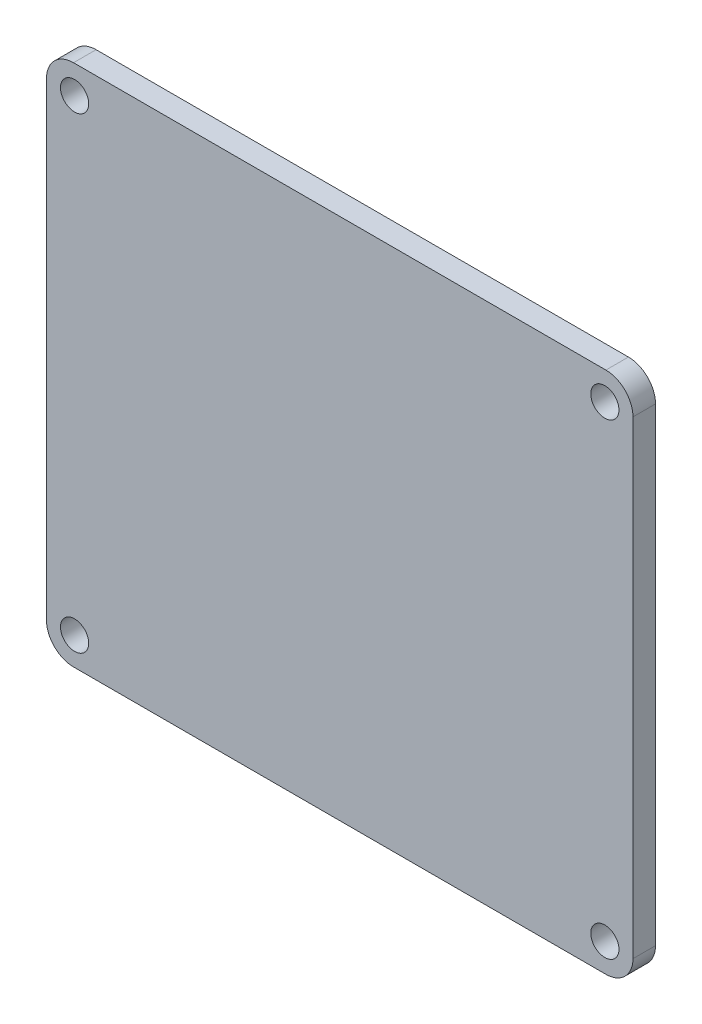
ISO-10303-21;
HEADER;
FILE_DESCRIPTION(('STEP AP214'),'2;1');
FILE_NAME('part.step','',(''),(''),'','','');
FILE_SCHEMA(('AUTOMOTIVE_DESIGN { 1 0 10303 214 1 1 1 1 }'));
ENDSEC;
DATA;
#1=APPLICATION_CONTEXT('core data for automotive mechanical design processes');
#2=APPLICATION_PROTOCOL_DEFINITION('international standard','automotive_design',2000,#1);
#3=PRODUCT_CONTEXT('',#1,'mechanical');
#4=PRODUCT('Part','Part','',(#3));
#5=PRODUCT_RELATED_PRODUCT_CATEGORY('part','',(#4));
#6=PRODUCT_DEFINITION_FORMATION('','',#4);
#7=PRODUCT_DEFINITION_CONTEXT('part definition',#1,'design');
#8=PRODUCT_DEFINITION('design','',#6,#7);
#9=PRODUCT_DEFINITION_SHAPE('','',#8);
#10=(LENGTH_UNIT() NAMED_UNIT(*) SI_UNIT(.MILLI.,.METRE.));
#11=(NAMED_UNIT(*) PLANE_ANGLE_UNIT() SI_UNIT($,.RADIAN.));
#12=(NAMED_UNIT(*) SI_UNIT($,.STERADIAN.) SOLID_ANGLE_UNIT());
#13=UNCERTAINTY_MEASURE_WITH_UNIT(LENGTH_MEASURE(1.E-05),#10,'distance_accuracy_value','');
#14=(GEOMETRIC_REPRESENTATION_CONTEXT(3) GLOBAL_UNCERTAINTY_ASSIGNED_CONTEXT((#13)) GLOBAL_UNIT_ASSIGNED_CONTEXT((#10,
#11,#12)) REPRESENTATION_CONTEXT('',''));
#15=CARTESIAN_POINT('',(0.,0.,0.));
#16=DIRECTION('',(0.,0.,1.));
#17=DIRECTION('',(1.,0.,0.));
#18=AXIS2_PLACEMENT_3D('',#15,#16,#17);
#19=CARTESIAN_POINT('',(0.,0.,2.5));
#20=DIRECTION('',(0.,1.,0.));
#21=DIRECTION('',(-1.,0.,0.));
#22=AXIS2_PLACEMENT_3D('',#19,#20,#21);
#23=PLANE('',#22);
#24=DIRECTION('',(1.,0.,0.));
#25=VECTOR('',#24,1.);
#26=CARTESIAN_POINT('',(0.,0.,0.));
#27=LINE('',#26,#25);
#28=CARTESIAN_POINT('',(3.,0.,0.));
#29=VERTEX_POINT('',#28);
#30=CARTESIAN_POINT('',(62.,0.,0.));
#31=VERTEX_POINT('',#30);
#32=EDGE_CURVE('E158',#29,#31,#27,.T.);
#33=ORIENTED_EDGE('',*,*,#32,.T.);
#34=DIRECTION('',(0.,0.,-1.));
#35=VECTOR('',#34,1.);
#36=CARTESIAN_POINT('',(62.,0.,2.5));
#37=LINE('',#36,#35);
#38=CARTESIAN_POINT('',(62.,0.,2.5));
#39=VERTEX_POINT('',#38);
#40=EDGE_CURVE('E145',#31,#39,#37,.F.);
#41=ORIENTED_EDGE('',*,*,#40,.T.);
#42=DIRECTION('',(1.,0.,0.));
#43=VECTOR('',#42,1.);
#44=CARTESIAN_POINT('',(0.,0.,2.5));
#45=LINE('',#44,#43);
#46=CARTESIAN_POINT('',(3.,0.,2.5));
#47=VERTEX_POINT('',#46);
#48=EDGE_CURVE('E160',#47,#39,#45,.T.);
#49=ORIENTED_EDGE('',*,*,#48,.F.);
#50=DIRECTION('',(0.,0.,-1.));
#51=VECTOR('',#50,1.);
#52=CARTESIAN_POINT('',(3.,0.,0.));
#53=LINE('',#52,#51);
#54=EDGE_CURVE('E142',#47,#29,#53,.T.);
#55=ORIENTED_EDGE('',*,*,#54,.T.);
#56=EDGE_LOOP('',(#33,#41,#49,#55));
#57=FACE_BOUND('',#56,.T.);
#58=ADVANCED_FACE('F33',(#57),#23,.F.);
#59=CARTESIAN_POINT('',(65.,0.,2.5));
#60=DIRECTION('',(-1.,0.,0.));
#61=DIRECTION('',(0.,0.,1.));
#62=AXIS2_PLACEMENT_3D('',#59,#60,#61);
#63=PLANE('',#62);
#64=DIRECTION('',(0.,1.,0.));
#65=VECTOR('',#64,1.);
#66=CARTESIAN_POINT('',(65.,0.,0.));
#67=LINE('',#66,#65);
#68=CARTESIAN_POINT('',(65.,3.,0.));
#69=VERTEX_POINT('',#68);
#70=CARTESIAN_POINT('',(65.,55.,0.));
#71=VERTEX_POINT('',#70);
#72=EDGE_CURVE('E116',#69,#71,#67,.T.);
#73=ORIENTED_EDGE('',*,*,#72,.T.);
#74=DIRECTION('',(0.,0.,-1.));
#75=VECTOR('',#74,1.);
#76=CARTESIAN_POINT('',(65.,55.,2.5));
#77=LINE('',#76,#75);
#78=CARTESIAN_POINT('',(65.,55.,2.5));
#79=VERTEX_POINT('',#78);
#80=EDGE_CURVE('E133',#71,#79,#77,.F.);
#81=ORIENTED_EDGE('',*,*,#80,.T.);
#82=DIRECTION('',(0.,1.,0.));
#83=VECTOR('',#82,1.);
#84=CARTESIAN_POINT('',(65.,0.,2.5));
#85=LINE('',#84,#83);
#86=CARTESIAN_POINT('',(65.,3.,2.5));
#87=VERTEX_POINT('',#86);
#88=EDGE_CURVE('E171',#87,#79,#85,.T.);
#89=ORIENTED_EDGE('',*,*,#88,.F.);
#90=DIRECTION('',(0.,0.,-1.));
#91=VECTOR('',#90,1.);
#92=CARTESIAN_POINT('',(65.,3.,2.5));
#93=LINE('',#92,#91);
#94=EDGE_CURVE('E130',#87,#69,#93,.T.);
#95=ORIENTED_EDGE('',*,*,#94,.T.);
#96=EDGE_LOOP('',(#73,#81,#89,#95));
#97=FACE_BOUND('',#96,.T.);
#98=ADVANCED_FACE('F218',(#97),#63,.F.);
#99=CARTESIAN_POINT('',(0.,58.,2.5));
#100=DIRECTION('',(0.,1.,0.));
#101=DIRECTION('',(-1.,0.,0.));
#102=AXIS2_PLACEMENT_3D('',#99,#100,#101);
#103=PLANE('',#102);
#104=DIRECTION('',(1.,0.,0.));
#105=VECTOR('',#104,1.);
#106=CARTESIAN_POINT('',(0.,58.,2.5));
#107=LINE('',#106,#105);
#108=CARTESIAN_POINT('',(3.,58.,2.5));
#109=VERTEX_POINT('',#108);
#110=CARTESIAN_POINT('',(62.,58.,2.5));
#111=VERTEX_POINT('',#110);
#112=EDGE_CURVE('E121',#109,#111,#107,.T.);
#113=ORIENTED_EDGE('',*,*,#112,.T.);
#114=DIRECTION('',(0.,0.,-1.));
#115=VECTOR('',#114,1.);
#116=CARTESIAN_POINT('',(62.,58.,0.));
#117=LINE('',#116,#115);
#118=CARTESIAN_POINT('',(62.,58.,0.));
#119=VERTEX_POINT('',#118);
#120=EDGE_CURVE('E108',#111,#119,#117,.T.);
#121=ORIENTED_EDGE('',*,*,#120,.T.);
#122=DIRECTION('',(1.,0.,0.));
#123=VECTOR('',#122,1.);
#124=CARTESIAN_POINT('',(0.,58.,0.));
#125=LINE('',#124,#123);
#126=CARTESIAN_POINT('',(3.,58.,0.));
#127=VERTEX_POINT('',#126);
#128=EDGE_CURVE('E101',#127,#119,#125,.T.);
#129=ORIENTED_EDGE('',*,*,#128,.F.);
#130=DIRECTION('',(0.,0.,-1.));
#131=VECTOR('',#130,1.);
#132=CARTESIAN_POINT('',(3.,58.,2.5));
#133=LINE('',#132,#131);
#134=EDGE_CURVE('E114',#127,#109,#133,.F.);
#135=ORIENTED_EDGE('',*,*,#134,.T.);
#136=EDGE_LOOP('',(#113,#121,#129,#135));
#137=FACE_BOUND('',#136,.T.);
#138=ADVANCED_FACE('F113',(#137),#103,.T.);
#139=CARTESIAN_POINT('',(0.,0.,2.5));
#140=DIRECTION('',(-1.,0.,0.));
#141=DIRECTION('',(0.,-1.,0.));
#142=AXIS2_PLACEMENT_3D('',#139,#140,#141);
#143=PLANE('',#142);
#144=DIRECTION('',(0.,1.,0.));
#145=VECTOR('',#144,1.);
#146=CARTESIAN_POINT('',(0.,0.,0.));
#147=LINE('',#146,#145);
#148=CARTESIAN_POINT('',(0.,3.,0.));
#149=VERTEX_POINT('',#148);
#150=CARTESIAN_POINT('',(0.,55.,0.));
#151=VERTEX_POINT('',#150);
#152=EDGE_CURVE('E102',#149,#151,#147,.T.);
#153=ORIENTED_EDGE('',*,*,#152,.F.);
#154=DIRECTION('',(0.,0.,-1.));
#155=VECTOR('',#154,1.);
#156=CARTESIAN_POINT('',(0.,3.,2.5));
#157=LINE('',#156,#155);
#158=CARTESIAN_POINT('',(0.,3.,2.5));
#159=VERTEX_POINT('',#158);
#160=EDGE_CURVE('E11',#149,#159,#157,.F.);
#161=ORIENTED_EDGE('',*,*,#160,.T.);
#162=DIRECTION('',(0.,1.,0.));
#163=VECTOR('',#162,1.);
#164=CARTESIAN_POINT('',(0.,0.,2.5));
#165=LINE('',#164,#163);
#166=CARTESIAN_POINT('',(0.,55.,2.5));
#167=VERTEX_POINT('',#166);
#168=EDGE_CURVE('E118',#159,#167,#165,.T.);
#169=ORIENTED_EDGE('',*,*,#168,.T.);
#170=DIRECTION('',(0.,0.,-1.));
#171=VECTOR('',#170,1.);
#172=CARTESIAN_POINT('',(0.,55.,2.5));
#173=LINE('',#172,#171);
#174=EDGE_CURVE('E41',#167,#151,#173,.T.);
#175=ORIENTED_EDGE('',*,*,#174,.T.);
#176=EDGE_LOOP('',(#153,#161,#169,#175));
#177=FACE_BOUND('',#176,.T.);
#178=ADVANCED_FACE('F146',(#177),#143,.T.);
#179=CARTESIAN_POINT('',(0.,0.,2.5));
#180=DIRECTION('',(0.,0.,1.));
#181=DIRECTION('',(1.,0.,0.));
#182=AXIS2_PLACEMENT_3D('',#179,#180,#181);
#183=PLANE('',#182);
#184=CARTESIAN_POINT('',(3.1155036511468,3.1155036511468,2.5));
#185=DIRECTION('',(0.,0.,1.));
#186=DIRECTION('',(1.,0.,0.));
#187=AXIS2_PLACEMENT_3D('',#184,#185,#186);
#188=CIRCLE('',#187,1.5625);
#189=CARTESIAN_POINT('',(4.6780036511468,3.1155036511468,2.5));
#190=VERTEX_POINT('',#189);
#191=EDGE_CURVE('E180',#190,#190,#188,.T.);
#192=ORIENTED_EDGE('',*,*,#191,.F.);
#193=EDGE_LOOP('',(#192));
#194=FACE_BOUND('',#193,.T.);
#195=CARTESIAN_POINT('',(61.8844963488532,3.11550365114681,2.5));
#196=DIRECTION('',(0.,0.,1.));
#197=DIRECTION('',(1.,0.,0.));
#198=AXIS2_PLACEMENT_3D('',#195,#196,#197);
#199=CIRCLE('',#198,1.56250005);
#200=CARTESIAN_POINT('',(63.4469963988532,3.11550365114681,2.5));
#201=VERTEX_POINT('',#200);
#202=EDGE_CURVE('E186',#201,#201,#199,.T.);
#203=ORIENTED_EDGE('',*,*,#202,.F.);
#204=EDGE_LOOP('',(#203));
#205=FACE_BOUND('',#204,.T.);
#206=CARTESIAN_POINT('',(61.8844963488532,54.8844963488532,2.5));
#207=DIRECTION('',(0.,0.,1.));
#208=DIRECTION('',(1.,0.,0.));
#209=AXIS2_PLACEMENT_3D('',#206,#207,#208);
#210=CIRCLE('',#209,1.56250005);
#211=CARTESIAN_POINT('',(63.4469963988532,54.8844963488532,2.5));
#212=VERTEX_POINT('',#211);
#213=EDGE_CURVE('E175',#212,#212,#210,.T.);
#214=ORIENTED_EDGE('',*,*,#213,.F.);
#215=EDGE_LOOP('',(#214));
#216=FACE_BOUND('',#215,.T.);
#217=CARTESIAN_POINT('',(3.1155036511468,54.8844963488532,2.5));
#218=DIRECTION('',(0.,0.,1.));
#219=DIRECTION('',(1.,0.,0.));
#220=AXIS2_PLACEMENT_3D('',#217,#218,#219);
#221=CIRCLE('',#220,1.56250005);
#222=CARTESIAN_POINT('',(4.6780037011468,54.8844963488532,2.5));
#223=VERTEX_POINT('',#222);
#224=EDGE_CURVE('E162',#223,#223,#221,.T.);
#225=ORIENTED_EDGE('',*,*,#224,.F.);
#226=EDGE_LOOP('',(#225));
#227=FACE_BOUND('',#226,.T.);
#228=ORIENTED_EDGE('',*,*,#88,.T.);
#229=CARTESIAN_POINT('',(62.,55.,2.5));
#230=DIRECTION('',(0.,0.,1.));
#231=DIRECTION('',(1.,0.,0.));
#232=AXIS2_PLACEMENT_3D('',#229,#230,#231);
#233=CIRCLE('',#232,3.);
#234=EDGE_CURVE('E140',#79,#111,#233,.T.);
#235=ORIENTED_EDGE('',*,*,#234,.T.);
#236=ORIENTED_EDGE('',*,*,#112,.F.);
#237=CARTESIAN_POINT('',(3.,55.,2.5));
#238=DIRECTION('',(0.,0.,1.));
#239=DIRECTION('',(1.,0.,0.));
#240=AXIS2_PLACEMENT_3D('',#237,#238,#239);
#241=CIRCLE('',#240,3.);
#242=EDGE_CURVE('E48',#109,#167,#241,.T.);
#243=ORIENTED_EDGE('',*,*,#242,.T.);
#244=ORIENTED_EDGE('',*,*,#168,.F.);
#245=CARTESIAN_POINT('',(3.,3.,2.5));
#246=DIRECTION('',(0.,0.,1.));
#247=DIRECTION('',(1.,0.,0.));
#248=AXIS2_PLACEMENT_3D('',#245,#246,#247);
#249=CIRCLE('',#248,3.);
#250=EDGE_CURVE('E136',#159,#47,#249,.T.);
#251=ORIENTED_EDGE('',*,*,#250,.T.);
#252=ORIENTED_EDGE('',*,*,#48,.T.);
#253=CARTESIAN_POINT('',(62.,3.,2.5));
#254=DIRECTION('',(0.,0.,1.));
#255=DIRECTION('',(1.,0.,0.));
#256=AXIS2_PLACEMENT_3D('',#253,#254,#255);
#257=CIRCLE('',#256,3.);
#258=EDGE_CURVE('E138',#39,#87,#257,.T.);
#259=ORIENTED_EDGE('',*,*,#258,.T.);
#260=EDGE_LOOP('',(#228,#235,#236,#243,#244,#251,#252,#259));
#261=FACE_BOUND('',#260,.T.);
#262=ADVANCED_FACE('F149',(#194,#205,#216,#227,#261),#183,.T.);
#263=CARTESIAN_POINT('',(0.,0.,0.));
#264=DIRECTION('',(0.,0.,1.));
#265=DIRECTION('',(1.,0.,0.));
#266=AXIS2_PLACEMENT_3D('',#263,#264,#265);
#267=PLANE('',#266);
#268=CARTESIAN_POINT('',(3.1155036511468,3.1155036511468,0.));
#269=DIRECTION('',(0.,0.,1.));
#270=DIRECTION('',(1.,0.,0.));
#271=AXIS2_PLACEMENT_3D('',#268,#269,#270);
#272=CIRCLE('',#271,1.5625);
#273=CARTESIAN_POINT('',(4.6780036511468,3.1155036511468,0.));
#274=VERTEX_POINT('',#273);
#275=EDGE_CURVE('E177',#274,#274,#272,.T.);
#276=ORIENTED_EDGE('',*,*,#275,.T.);
#277=EDGE_LOOP('',(#276));
#278=FACE_BOUND('',#277,.T.);
#279=CARTESIAN_POINT('',(61.8844963488532,3.11550365114681,0.));
#280=DIRECTION('',(0.,0.,1.));
#281=DIRECTION('',(1.,0.,0.));
#282=AXIS2_PLACEMENT_3D('',#279,#280,#281);
#283=CIRCLE('',#282,1.56250005);
#284=CARTESIAN_POINT('',(63.4469963988532,3.11550365114681,0.));
#285=VERTEX_POINT('',#284);
#286=EDGE_CURVE('E183',#285,#285,#283,.T.);
#287=ORIENTED_EDGE('',*,*,#286,.T.);
#288=EDGE_LOOP('',(#287));
#289=FACE_BOUND('',#288,.T.);
#290=CARTESIAN_POINT('',(61.8844963488532,54.8844963488532,0.));
#291=DIRECTION('',(0.,0.,1.));
#292=DIRECTION('',(1.,0.,0.));
#293=AXIS2_PLACEMENT_3D('',#290,#291,#292);
#294=CIRCLE('',#293,1.56250005);
#295=CARTESIAN_POINT('',(63.4469963988532,54.8844963488532,0.));
#296=VERTEX_POINT('',#295);
#297=EDGE_CURVE('E189',#296,#296,#294,.T.);
#298=ORIENTED_EDGE('',*,*,#297,.T.);
#299=EDGE_LOOP('',(#298));
#300=FACE_BOUND('',#299,.T.);
#301=CARTESIAN_POINT('',(3.1155036511468,54.8844963488532,0.));
#302=DIRECTION('',(0.,0.,1.));
#303=DIRECTION('',(1.,0.,0.));
#304=AXIS2_PLACEMENT_3D('',#301,#302,#303);
#305=CIRCLE('',#304,1.56250005);
#306=CARTESIAN_POINT('',(4.6780037011468,54.8844963488532,0.));
#307=VERTEX_POINT('',#306);
#308=EDGE_CURVE('E167',#307,#307,#305,.T.);
#309=ORIENTED_EDGE('',*,*,#308,.T.);
#310=EDGE_LOOP('',(#309));
#311=FACE_BOUND('',#310,.T.);
#312=ORIENTED_EDGE('',*,*,#128,.T.);
#313=CARTESIAN_POINT('',(62.,55.,0.));
#314=DIRECTION('',(0.,0.,1.));
#315=DIRECTION('',(1.,0.,0.));
#316=AXIS2_PLACEMENT_3D('',#313,#314,#315);
#317=CIRCLE('',#316,3.);
#318=EDGE_CURVE('E128',#119,#71,#317,.F.);
#319=ORIENTED_EDGE('',*,*,#318,.T.);
#320=ORIENTED_EDGE('',*,*,#72,.F.);
#321=CARTESIAN_POINT('',(62.,3.,0.));
#322=DIRECTION('',(0.,0.,1.));
#323=DIRECTION('',(1.,0.,0.));
#324=AXIS2_PLACEMENT_3D('',#321,#322,#323);
#325=CIRCLE('',#324,3.);
#326=EDGE_CURVE('E126',#69,#31,#325,.F.);
#327=ORIENTED_EDGE('',*,*,#326,.T.);
#328=ORIENTED_EDGE('',*,*,#32,.F.);
#329=CARTESIAN_POINT('',(3.,3.,0.));
#330=DIRECTION('',(0.,0.,1.));
#331=DIRECTION('',(1.,0.,0.));
#332=AXIS2_PLACEMENT_3D('',#329,#330,#331);
#333=CIRCLE('',#332,3.);
#334=EDGE_CURVE('E107',#29,#149,#333,.F.);
#335=ORIENTED_EDGE('',*,*,#334,.T.);
#336=ORIENTED_EDGE('',*,*,#152,.T.);
#337=CARTESIAN_POINT('',(3.,55.,0.));
#338=DIRECTION('',(0.,0.,1.));
#339=DIRECTION('',(1.,0.,0.));
#340=AXIS2_PLACEMENT_3D('',#337,#338,#339);
#341=CIRCLE('',#340,3.);
#342=EDGE_CURVE('E98',#151,#127,#341,.F.);
#343=ORIENTED_EDGE('',*,*,#342,.T.);
#344=EDGE_LOOP('',(#312,#319,#320,#327,#328,#335,#336,#343));
#345=FACE_BOUND('',#344,.T.);
#346=ADVANCED_FACE('F100',(#278,#289,#300,#311,#345),#267,.F.);
#347=CARTESIAN_POINT('',(3.1155036511468,54.8844963488532,2.5));
#348=DIRECTION('',(0.,0.,-1.));
#349=DIRECTION('',(-1.,0.,0.));
#350=AXIS2_PLACEMENT_3D('',#347,#348,#349);
#351=CYLINDRICAL_SURFACE('',#350,1.56250005);
#352=ORIENTED_EDGE('',*,*,#224,.T.);
#353=EDGE_LOOP('',(#352));
#354=FACE_BOUND('',#353,.T.);
#355=ORIENTED_EDGE('',*,*,#308,.F.);
#356=EDGE_LOOP('',(#355));
#357=FACE_BOUND('',#356,.T.);
#358=ADVANCED_FACE('F204',(#354,#357),#351,.F.);
#359=CARTESIAN_POINT('',(61.8844963488532,54.8844963488532,2.5));
#360=DIRECTION('',(0.,0.,-1.));
#361=DIRECTION('',(-1.,0.,0.));
#362=AXIS2_PLACEMENT_3D('',#359,#360,#361);
#363=CYLINDRICAL_SURFACE('',#362,1.56250005);
#364=ORIENTED_EDGE('',*,*,#213,.T.);
#365=EDGE_LOOP('',(#364));
#366=FACE_BOUND('',#365,.T.);
#367=ORIENTED_EDGE('',*,*,#297,.F.);
#368=EDGE_LOOP('',(#367));
#369=FACE_BOUND('',#368,.T.);
#370=ADVANCED_FACE('F195',(#366,#369),#363,.F.);
#371=CARTESIAN_POINT('',(61.8844963488532,3.11550365114681,2.5));
#372=DIRECTION('',(0.,0.,-1.));
#373=DIRECTION('',(-1.,0.,0.));
#374=AXIS2_PLACEMENT_3D('',#371,#372,#373);
#375=CYLINDRICAL_SURFACE('',#374,1.56250005);
#376=ORIENTED_EDGE('',*,*,#202,.T.);
#377=EDGE_LOOP('',(#376));
#378=FACE_BOUND('',#377,.T.);
#379=ORIENTED_EDGE('',*,*,#286,.F.);
#380=EDGE_LOOP('',(#379));
#381=FACE_BOUND('',#380,.T.);
#382=ADVANCED_FACE('F301',(#378,#381),#375,.F.);
#383=CARTESIAN_POINT('',(3.1155036511468,3.1155036511468,2.5));
#384=DIRECTION('',(0.,0.,-1.));
#385=DIRECTION('',(-1.,0.,0.));
#386=AXIS2_PLACEMENT_3D('',#383,#384,#385);
#387=CYLINDRICAL_SURFACE('',#386,1.5625);
#388=ORIENTED_EDGE('',*,*,#191,.T.);
#389=EDGE_LOOP('',(#388));
#390=FACE_BOUND('',#389,.T.);
#391=ORIENTED_EDGE('',*,*,#275,.F.);
#392=EDGE_LOOP('',(#391));
#393=FACE_BOUND('',#392,.T.);
#394=ADVANCED_FACE('F231',(#390,#393),#387,.F.);
#395=CARTESIAN_POINT('',(62.,55.,2.5));
#396=DIRECTION('',(0.,0.,1.));
#397=DIRECTION('',(1.,0.,0.));
#398=AXIS2_PLACEMENT_3D('',#395,#396,#397);
#399=CYLINDRICAL_SURFACE('',#398,3.);
#400=ORIENTED_EDGE('',*,*,#234,.F.);
#401=ORIENTED_EDGE('',*,*,#80,.F.);
#402=ORIENTED_EDGE('',*,*,#318,.F.);
#403=ORIENTED_EDGE('',*,*,#120,.F.);
#404=EDGE_LOOP('',(#400,#401,#402,#403));
#405=FACE_BOUND('',#404,.T.);
#406=ADVANCED_FACE('F227',(#405),#399,.T.);
#407=CARTESIAN_POINT('',(62.,3.,2.5));
#408=DIRECTION('',(0.,0.,-1.));
#409=DIRECTION('',(-1.,0.,0.));
#410=AXIS2_PLACEMENT_3D('',#407,#408,#409);
#411=CYLINDRICAL_SURFACE('',#410,3.);
#412=ORIENTED_EDGE('',*,*,#258,.F.);
#413=ORIENTED_EDGE('',*,*,#40,.F.);
#414=ORIENTED_EDGE('',*,*,#326,.F.);
#415=ORIENTED_EDGE('',*,*,#94,.F.);
#416=EDGE_LOOP('',(#412,#413,#414,#415));
#417=FACE_BOUND('',#416,.T.);
#418=ADVANCED_FACE('F230',(#417),#411,.T.);
#419=CARTESIAN_POINT('',(3.,3.,2.5));
#420=DIRECTION('',(0.,0.,1.));
#421=DIRECTION('',(1.,0.,0.));
#422=AXIS2_PLACEMENT_3D('',#419,#420,#421);
#423=CYLINDRICAL_SURFACE('',#422,3.);
#424=ORIENTED_EDGE('',*,*,#250,.F.);
#425=ORIENTED_EDGE('',*,*,#160,.F.);
#426=ORIENTED_EDGE('',*,*,#334,.F.);
#427=ORIENTED_EDGE('',*,*,#54,.F.);
#428=EDGE_LOOP('',(#424,#425,#426,#427));
#429=FACE_BOUND('',#428,.T.);
#430=ADVANCED_FACE('F154',(#429),#423,.T.);
#431=CARTESIAN_POINT('',(3.,55.,2.5));
#432=DIRECTION('',(0.,0.,-1.));
#433=DIRECTION('',(-1.,0.,0.));
#434=AXIS2_PLACEMENT_3D('',#431,#432,#433);
#435=CYLINDRICAL_SURFACE('',#434,3.);
#436=ORIENTED_EDGE('',*,*,#242,.F.);
#437=ORIENTED_EDGE('',*,*,#134,.F.);
#438=ORIENTED_EDGE('',*,*,#342,.F.);
#439=ORIENTED_EDGE('',*,*,#174,.F.);
#440=EDGE_LOOP('',(#436,#437,#438,#439));
#441=FACE_BOUND('',#440,.T.);
#442=ADVANCED_FACE('F35',(#441),#435,.T.);
#443=CLOSED_SHELL('',(#58,#98,#138,#178,#262,#346,#358,#370,#382,#394,#406,#418,#430,#442));
#444=MANIFOLD_SOLID_BREP('B2',#443);
#445=ADVANCED_BREP_SHAPE_REPRESENTATION('',(#18,#444),#14);
#446=SHAPE_DEFINITION_REPRESENTATION(#9,#445);
ENDSEC;
END-ISO-10303-21;
